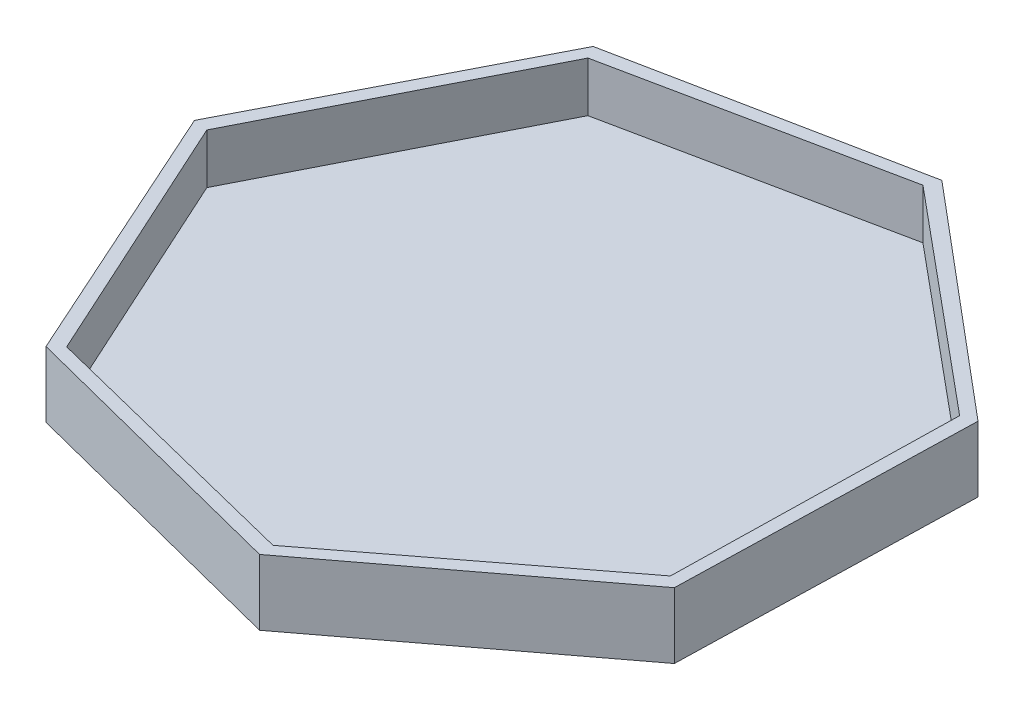
ISO-10303-21;
HEADER;
FILE_DESCRIPTION(('STEP AP214'),'2;1');
FILE_NAME('part.step','',(''),(''),'','','');
FILE_SCHEMA(('AUTOMOTIVE_DESIGN { 1 0 10303 214 1 1 1 1 }'));
ENDSEC;
DATA;
#1=APPLICATION_CONTEXT('core data for automotive mechanical design processes');
#2=APPLICATION_PROTOCOL_DEFINITION('international standard','automotive_design',2000,#1);
#3=PRODUCT_CONTEXT('',#1,'mechanical');
#4=PRODUCT('Part','Part','',(#3));
#5=PRODUCT_RELATED_PRODUCT_CATEGORY('part','',(#4));
#6=PRODUCT_DEFINITION_FORMATION('','',#4);
#7=PRODUCT_DEFINITION_CONTEXT('part definition',#1,'design');
#8=PRODUCT_DEFINITION('design','',#6,#7);
#9=PRODUCT_DEFINITION_SHAPE('','',#8);
#10=(LENGTH_UNIT() NAMED_UNIT(*) SI_UNIT(.MILLI.,.METRE.));
#11=(NAMED_UNIT(*) PLANE_ANGLE_UNIT() SI_UNIT($,.RADIAN.));
#12=(NAMED_UNIT(*) SI_UNIT($,.STERADIAN.) SOLID_ANGLE_UNIT());
#13=UNCERTAINTY_MEASURE_WITH_UNIT(LENGTH_MEASURE(1.E-05),#10,'distance_accuracy_value','');
#14=(GEOMETRIC_REPRESENTATION_CONTEXT(3) GLOBAL_UNCERTAINTY_ASSIGNED_CONTEXT((#13)) GLOBAL_UNIT_ASSIGNED_CONTEXT((#10,
#11,#12)) REPRESENTATION_CONTEXT('',''));
#15=CARTESIAN_POINT('',(0.,0.,0.));
#16=DIRECTION('',(0.,0.,1.));
#17=DIRECTION('',(1.,0.,0.));
#18=AXIS2_PLACEMENT_3D('',#15,#16,#17);
#19=CARTESIAN_POINT('',(-25.9635966528561,5.,-0.669763423308489));
#20=DIRECTION('',(0.911858095260724,0.,-0.410505559167576));
#21=DIRECTION('',(-0.410505559167576,0.,-0.911858095260724));
#22=AXIS2_PLACEMENT_3D('',#19,#20,#21);
#23=PLANE('',#22);
#24=DIRECTION('',(0.410505559167576,0.,0.911858095260724));
#25=VECTOR('',#24,1.);
#26=CARTESIAN_POINT('',(-25.9635966528561,0.,-0.669763423308489));
#27=LINE('',#26,#25);
#28=CARTESIAN_POINT('',(-25.9635966528561,0.,-0.669763423308489));
#29=VERTEX_POINT('',#28);
#30=CARTESIAN_POINT('',(-16.7116798627775,0.,19.8815665972136));
#31=VERTEX_POINT('',#30);
#32=EDGE_CURVE('E135',#29,#31,#27,.T.);
#33=ORIENTED_EDGE('',*,*,#32,.T.);
#34=DIRECTION('',(0.,-1.,0.));
#35=VECTOR('',#34,1.);
#36=CARTESIAN_POINT('',(-16.7116798627775,5.,19.8815665972136));
#37=LINE('',#36,#35);
#38=CARTESIAN_POINT('',(-16.7116798627775,5.,19.8815665972136));
#39=VERTEX_POINT('',#38);
#40=EDGE_CURVE('E11',#39,#31,#37,.T.);
#41=ORIENTED_EDGE('',*,*,#40,.F.);
#42=DIRECTION('',(0.410505559167576,0.,0.911858095260724));
#43=VECTOR('',#42,1.);
#44=CARTESIAN_POINT('',(-25.9635966528561,5.,-0.669763423308489));
#45=LINE('',#44,#43);
#46=CARTESIAN_POINT('',(-25.9635966528561,5.,-0.669763423308489));
#47=VERTEX_POINT('',#46);
#48=EDGE_CURVE('E149',#47,#39,#45,.T.);
#49=ORIENTED_EDGE('',*,*,#48,.F.);
#50=DIRECTION('',(0.,-1.,0.));
#51=VECTOR('',#50,1.);
#52=CARTESIAN_POINT('',(-25.9635966528561,5.,-0.669763423308489));
#53=LINE('',#52,#51);
#54=EDGE_CURVE('E131',#47,#29,#53,.T.);
#55=ORIENTED_EDGE('',*,*,#54,.T.);
#56=EDGE_LOOP('',(#33,#41,#49,#55));
#57=FACE_BOUND('',#56,.T.);
#58=ADVANCED_FACE('F33',(#57),#23,.F.);
#59=CARTESIAN_POINT('',(-16.7116798627775,5.,19.8815665972136));
#60=DIRECTION('',(0.247588053252038,0.,-0.968865396165466));
#61=DIRECTION('',(-0.968865396165466,0.,-0.247588053252038));
#62=AXIS2_PLACEMENT_3D('',#59,#60,#61);
#63=PLANE('',#62);
#64=DIRECTION('',(0.968865396165466,0.,0.247588053252038));
#65=VECTOR('',#64,1.);
#66=CARTESIAN_POINT('',(-16.7116798627775,0.,19.8815665972136));
#67=LINE('',#66,#65);
#68=CARTESIAN_POINT('',(5.12447272011667,0.,25.4616714599844));
#69=VERTEX_POINT('',#68);
#70=EDGE_CURVE('E138',#31,#69,#67,.T.);
#71=ORIENTED_EDGE('',*,*,#70,.T.);
#72=DIRECTION('',(0.,-1.,0.));
#73=VECTOR('',#72,1.);
#74=CARTESIAN_POINT('',(5.12447272011667,5.,25.4616714599844));
#75=LINE('',#74,#73);
#76=CARTESIAN_POINT('',(5.12447272011667,5.,25.4616714599844));
#77=VERTEX_POINT('',#76);
#78=EDGE_CURVE('E40',#77,#69,#75,.T.);
#79=ORIENTED_EDGE('',*,*,#78,.F.);
#80=DIRECTION('',(0.968865396165466,0.,0.247588053252038));
#81=VECTOR('',#80,1.);
#82=CARTESIAN_POINT('',(-16.7116798627775,5.,19.8815665972136));
#83=LINE('',#82,#81);
#84=EDGE_CURVE('E94',#39,#77,#83,.T.);
#85=ORIENTED_EDGE('',*,*,#84,.F.);
#86=ORIENTED_EDGE('',*,*,#40,.T.);
#87=EDGE_LOOP('',(#71,#79,#85,#86));
#88=FACE_BOUND('',#87,.T.);
#89=ADVANCED_FACE('F295',(#88),#63,.F.);
#90=CARTESIAN_POINT('',(5.12447272011667,5.,25.4616714599844));
#91=DIRECTION('',(-0.603120842731318,0.,-0.797649828598405));
#92=DIRECTION('',(-0.797649828598405,0.,0.603120842731318));
#93=AXIS2_PLACEMENT_3D('',#90,#91,#92);
#94=PLANE('',#93);
#95=DIRECTION('',(0.797649828598405,0.,-0.603120842731318));
#96=VECTOR('',#95,1.);
#97=CARTESIAN_POINT('',(5.12447272011667,0.,25.4616714599844));
#98=LINE('',#97,#96);
#99=CARTESIAN_POINT('',(23.1017928245695,0.,11.868618389942));
#100=VERTEX_POINT('',#99);
#101=EDGE_CURVE('E141',#69,#100,#98,.T.);
#102=ORIENTED_EDGE('',*,*,#101,.T.);
#103=DIRECTION('',(0.,-1.,0.));
#104=VECTOR('',#103,1.);
#105=CARTESIAN_POINT('',(23.1017928245695,5.,11.868618389942));
#106=LINE('',#105,#104);
#107=CARTESIAN_POINT('',(23.1017928245695,5.,11.868618389942));
#108=VERTEX_POINT('',#107);
#109=EDGE_CURVE('E153',#108,#100,#106,.T.);
#110=ORIENTED_EDGE('',*,*,#109,.F.);
#111=DIRECTION('',(0.797649828598405,0.,-0.603120842731318));
#112=VECTOR('',#111,1.);
#113=CARTESIAN_POINT('',(5.12447272011667,5.,25.4616714599844));
#114=LINE('',#113,#112);
#115=EDGE_CURVE('E161',#77,#108,#114,.T.);
#116=ORIENTED_EDGE('',*,*,#115,.F.);
#117=ORIENTED_EDGE('',*,*,#78,.T.);
#118=EDGE_LOOP('',(#102,#110,#116,#117));
#119=FACE_BOUND('',#118,.T.);
#120=ADVANCED_FACE('F159',(#119),#94,.F.);
#121=CARTESIAN_POINT('',(23.1017928245695,5.,11.868618389942));
#122=DIRECTION('',(-0.999667442714883,0.,-0.0257876710054741));
#123=DIRECTION('',(-0.0257876710054741,0.,0.999667442714883));
#124=AXIS2_PLACEMENT_3D('',#121,#122,#123);
#125=PLANE('',#124);
#126=DIRECTION('',(0.0257876710054741,0.,-0.999667442714883));
#127=VECTOR('',#126,1.);
#128=CARTESIAN_POINT('',(23.1017928245695,0.,11.868618389942));
#129=LINE('',#128,#127);
#130=CARTESIAN_POINT('',(23.682991741428,0.,-10.6617464034206));
#131=VERTEX_POINT('',#130);
#132=EDGE_CURVE('E143',#100,#131,#129,.T.);
#133=ORIENTED_EDGE('',*,*,#132,.T.);
#134=DIRECTION('',(0.,-1.,0.));
#135=VECTOR('',#134,1.);
#136=CARTESIAN_POINT('',(23.682991741428,5.,-10.6617464034206));
#137=LINE('',#136,#135);
#138=CARTESIAN_POINT('',(23.682991741428,5.,-10.6617464034206));
#139=VERTEX_POINT('',#138);
#140=EDGE_CURVE('E126',#139,#131,#137,.T.);
#141=ORIENTED_EDGE('',*,*,#140,.F.);
#142=DIRECTION('',(0.0257876710054741,0.,-0.999667442714883));
#143=VECTOR('',#142,1.);
#144=CARTESIAN_POINT('',(23.1017928245695,5.,11.868618389942));
#145=LINE('',#144,#143);
#146=EDGE_CURVE('E114',#108,#139,#145,.T.);
#147=ORIENTED_EDGE('',*,*,#146,.F.);
#148=ORIENTED_EDGE('',*,*,#109,.T.);
#149=EDGE_LOOP('',(#133,#141,#147,#148));
#150=FACE_BOUND('',#149,.T.);
#151=ADVANCED_FACE('F167',(#150),#125,.F.);
#152=CARTESIAN_POINT('',(23.682991741428,5.,-10.6617464034206));
#153=DIRECTION('',(-0.643444068834542,0.,0.765493128827196));
#154=DIRECTION('',(0.765493128827196,0.,0.643444068834542));
#155=AXIS2_PLACEMENT_3D('',#152,#153,#154);
#156=PLANE('',#155);
#157=DIRECTION('',(-0.765493128827196,0.,-0.643444068834542));
#158=VECTOR('',#157,1.);
#159=CARTESIAN_POINT('',(23.682991741428,0.,-10.6617464034206));
#160=LINE('',#159,#158);
#161=CARTESIAN_POINT('',(6.43041483200048,0.,-25.1635986950156));
#162=VERTEX_POINT('',#161);
#163=EDGE_CURVE('E123',#131,#162,#160,.T.);
#164=ORIENTED_EDGE('',*,*,#163,.T.);
#165=DIRECTION('',(0.,-1.,0.));
#166=VECTOR('',#165,1.);
#167=CARTESIAN_POINT('',(6.43041483200048,5.,-25.1635986950156));
#168=LINE('',#167,#166);
#169=CARTESIAN_POINT('',(6.43041483200048,5.,-25.1635986950156));
#170=VERTEX_POINT('',#169);
#171=EDGE_CURVE('E120',#170,#162,#168,.T.);
#172=ORIENTED_EDGE('',*,*,#171,.F.);
#173=DIRECTION('',(-0.765493128827196,0.,-0.643444068834542));
#174=VECTOR('',#173,1.);
#175=CARTESIAN_POINT('',(23.682991741428,5.,-10.6617464034206));
#176=LINE('',#175,#174);
#177=EDGE_CURVE('E107',#139,#170,#176,.T.);
#178=ORIENTED_EDGE('',*,*,#177,.F.);
#179=ORIENTED_EDGE('',*,*,#140,.T.);
#180=EDGE_LOOP('',(#164,#172,#178,#179));
#181=FACE_BOUND('',#180,.T.);
#182=ADVANCED_FACE('F121',(#181),#156,.F.);
#183=CARTESIAN_POINT('',(6.43041483200048,5.,-25.1635986950156));
#184=DIRECTION('',(0.197305812745234,0.,0.98034198943886));
#185=DIRECTION('',(0.98034198943886,0.,-0.197305812745234));
#186=AXIS2_PLACEMENT_3D('',#183,#184,#185);
#187=PLANE('',#186);
#188=DIRECTION('',(-0.98034198943886,0.,0.197305812745234));
#189=VECTOR('',#188,1.);
#190=CARTESIAN_POINT('',(6.43041483200048,0.,-25.1635986950156));
#191=LINE('',#190,#189);
#192=CARTESIAN_POINT('',(-15.6643956024812,0.,-20.7167479253953));
#193=VERTEX_POINT('',#192);
#194=EDGE_CURVE('E146',#162,#193,#191,.T.);
#195=ORIENTED_EDGE('',*,*,#194,.T.);
#196=DIRECTION('',(0.,-1.,0.));
#197=VECTOR('',#196,1.);
#198=CARTESIAN_POINT('',(-15.6643956024812,5.,-20.7167479253953));
#199=LINE('',#198,#197);
#200=CARTESIAN_POINT('',(-15.6643956024812,5.,-20.7167479253953));
#201=VERTEX_POINT('',#200);
#202=EDGE_CURVE('E127',#201,#193,#199,.T.);
#203=ORIENTED_EDGE('',*,*,#202,.F.);
#204=DIRECTION('',(-0.98034198943886,0.,0.197305812745234));
#205=VECTOR('',#204,1.);
#206=CARTESIAN_POINT('',(6.43041483200048,5.,-25.1635986950156));
#207=LINE('',#206,#205);
#208=EDGE_CURVE('E111',#170,#201,#207,.T.);
#209=ORIENTED_EDGE('',*,*,#208,.F.);
#210=ORIENTED_EDGE('',*,*,#171,.T.);
#211=EDGE_LOOP('',(#195,#203,#209,#210));
#212=FACE_BOUND('',#211,.T.);
#213=ADVANCED_FACE('F129',(#212),#187,.F.);
#214=CARTESIAN_POINT('',(-15.6643956024812,5.,-20.7167479253953));
#215=DIRECTION('',(0.889480393022744,0.,0.456973336670866));
#216=DIRECTION('',(0.456973336670866,0.,-0.889480393022744));
#217=AXIS2_PLACEMENT_3D('',#214,#215,#216);
#218=PLANE('',#217);
#219=DIRECTION('',(-0.456973336670866,0.,0.889480393022744));
#220=VECTOR('',#219,1.);
#221=CARTESIAN_POINT('',(-15.6643956024812,0.,-20.7167479253953));
#222=LINE('',#221,#220);
#223=EDGE_CURVE('E86',#193,#29,#222,.T.);
#224=ORIENTED_EDGE('',*,*,#223,.T.);
#225=ORIENTED_EDGE('',*,*,#54,.F.);
#226=DIRECTION('',(-0.456973336670866,0.,0.889480393022744));
#227=VECTOR('',#226,1.);
#228=CARTESIAN_POINT('',(-15.6643956024812,5.,-20.7167479253953));
#229=LINE('',#228,#227);
#230=EDGE_CURVE('E56',#201,#47,#229,.T.);
#231=ORIENTED_EDGE('',*,*,#230,.F.);
#232=ORIENTED_EDGE('',*,*,#202,.T.);
#233=EDGE_LOOP('',(#224,#225,#231,#232));
#234=FACE_BOUND('',#233,.T.);
#235=ADVANCED_FACE('F302',(#234),#218,.F.);
#236=CARTESIAN_POINT('',(0.,5.,0.));
#237=DIRECTION('',(0.,1.,0.));
#238=DIRECTION('',(0.,0.,1.));
#239=AXIS2_PLACEMENT_3D('',#236,#237,#238);
#240=PLANE('',#239);
#241=DIRECTION('',(-0.768866637447622,0.,-0.6394091755832));
#242=VECTOR('',#241,1.);
#243=CARTESIAN_POINT('',(22.6201437552723,5.,-10.3266868379717));
#244=LINE('',#243,#242);
#245=CARTESIAN_POINT('',(22.6201437552723,5.,-10.3266868379717));
#246=VERTEX_POINT('',#245);
#247=CARTESIAN_POINT('',(6.02970006847634,5.,-24.1237244562886));
#248=VERTEX_POINT('',#247);
#249=EDGE_CURVE('E47',#246,#248,#244,.T.);
#250=ORIENTED_EDGE('',*,*,#249,.F.);
#251=DIRECTION('',(0.0205297162118656,0.,-0.999789243166909));
#252=VECTOR('',#251,1.);
#253=CARTESIAN_POINT('',(22.1771578275053,5.,11.2465565953604));
#254=LINE('',#253,#252);
#255=CARTESIAN_POINT('',(22.1771578275053,5.,11.2465565953604));
#256=VERTEX_POINT('',#255);
#257=EDGE_CURVE('E191',#256,#246,#254,.T.);
#258=ORIENTED_EDGE('',*,*,#257,.F.);
#259=DIRECTION('',(0.794466774833926,0.,-0.607307618662058));
#260=VECTOR('',#259,1.);
#261=CARTESIAN_POINT('',(5.03431972404994,5.,24.3509135244402));
#262=LINE('',#261,#260);
#263=CARTESIAN_POINT('',(5.03431972404994,5.,24.3509135244402));
#264=VERTEX_POINT('',#263);
#265=EDGE_CURVE('E195',#264,#256,#262,.T.);
#266=ORIENTED_EDGE('',*,*,#265,.F.);
#267=DIRECTION('',(0.970154147837238,0.,0.242489029513096));
#268=VECTOR('',#267,1.);
#269=CARTESIAN_POINT('',(-15.8994638130225,5.,19.1185359015044));
#270=LINE('',#269,#268);
#271=CARTESIAN_POINT('',(-15.8994638130225,5.,19.1185359015044));
#272=VERTEX_POINT('',#271);
#273=EDGE_CURVE('E198',#272,#264,#270,.T.);
#274=ORIENTED_EDGE('',*,*,#273,.F.);
#275=DIRECTION('',(0.415295659981009,0.,0.909686492590133));
#276=VECTOR('',#275,1.);
#277=CARTESIAN_POINT('',(-24.8606268089329,5.,-0.510489202324105));
#278=LINE('',#277,#276);
#279=CARTESIAN_POINT('',(-24.8606268089329,5.,-0.510489202324105));
#280=VERTEX_POINT('',#279);
#281=EDGE_CURVE('E201',#280,#272,#278,.T.);
#282=ORIENTED_EDGE('',*,*,#281,.F.);
#283=DIRECTION('',(-0.452288930328535,0.,0.89187147252408));
#284=VECTOR('',#283,1.);
#285=CARTESIAN_POINT('',(-15.1012307533485,5.,-19.7551055247205));
#286=LINE('',#285,#284);
#287=CARTESIAN_POINT('',(-15.1012307533485,5.,-19.7551055247205));
#288=VERTEX_POINT('',#287);
#289=EDGE_CURVE('E204',#288,#280,#286,.T.);
#290=ORIENTED_EDGE('',*,*,#289,.F.);
#291=DIRECTION('',(-0.979290731087882,0.,0.202459042784858));
#292=VECTOR('',#291,1.);
#293=CARTESIAN_POINT('',(6.02970006847634,5.,-24.1237244562886));
#294=LINE('',#293,#292);
#295=EDGE_CURVE('E207',#248,#288,#294,.T.);
#296=ORIENTED_EDGE('',*,*,#295,.F.);
#297=EDGE_LOOP('',(#250,#258,#266,#274,#282,#290,#296));
#298=FACE_BOUND('',#297,.T.);
#299=ORIENTED_EDGE('',*,*,#48,.T.);
#300=ORIENTED_EDGE('',*,*,#84,.T.);
#301=ORIENTED_EDGE('',*,*,#115,.T.);
#302=ORIENTED_EDGE('',*,*,#146,.T.);
#303=ORIENTED_EDGE('',*,*,#177,.T.);
#304=ORIENTED_EDGE('',*,*,#208,.T.);
#305=ORIENTED_EDGE('',*,*,#230,.T.);
#306=EDGE_LOOP('',(#299,#300,#301,#302,#303,#304,#305));
#307=FACE_BOUND('',#306,.T.);
#308=ADVANCED_FACE('F109',(#298,#307),#240,.T.);
#309=CARTESIAN_POINT('',(0.,0.,0.));
#310=DIRECTION('',(0.,1.,0.));
#311=DIRECTION('',(0.,0.,1.));
#312=AXIS2_PLACEMENT_3D('',#309,#310,#311);
#313=PLANE('',#312);
#314=ORIENTED_EDGE('',*,*,#32,.F.);
#315=ORIENTED_EDGE('',*,*,#223,.F.);
#316=ORIENTED_EDGE('',*,*,#194,.F.);
#317=ORIENTED_EDGE('',*,*,#163,.F.);
#318=ORIENTED_EDGE('',*,*,#132,.F.);
#319=ORIENTED_EDGE('',*,*,#101,.F.);
#320=ORIENTED_EDGE('',*,*,#70,.F.);
#321=EDGE_LOOP('',(#314,#315,#316,#317,#318,#319,#320));
#322=FACE_BOUND('',#321,.T.);
#323=ADVANCED_FACE('F165',(#322),#313,.F.);
#324=CARTESIAN_POINT('',(22.6201437552723,1.2,-10.3266868379717));
#325=DIRECTION('',(0.6394091755832,0.,-0.768866637447622));
#326=DIRECTION('',(-0.768866637447622,0.,-0.6394091755832));
#327=AXIS2_PLACEMENT_3D('',#324,#325,#326);
#328=PLANE('',#327);
#329=ORIENTED_EDGE('',*,*,#249,.T.);
#330=DIRECTION('',(0.,1.,0.));
#331=VECTOR('',#330,1.);
#332=CARTESIAN_POINT('',(6.02970006847634,1.2,-24.1237244562886));
#333=LINE('',#332,#331);
#334=CARTESIAN_POINT('',(6.02970006847634,1.2,-24.1237244562886));
#335=VERTEX_POINT('',#334);
#336=EDGE_CURVE('E172',#335,#248,#333,.T.);
#337=ORIENTED_EDGE('',*,*,#336,.F.);
#338=DIRECTION('',(-0.768866637447622,0.,-0.6394091755832));
#339=VECTOR('',#338,1.);
#340=CARTESIAN_POINT('',(22.6201437552723,1.2,-10.3266868379717));
#341=LINE('',#340,#339);
#342=CARTESIAN_POINT('',(22.6201437552723,1.2,-10.3266868379717));
#343=VERTEX_POINT('',#342);
#344=EDGE_CURVE('E194',#343,#335,#341,.T.);
#345=ORIENTED_EDGE('',*,*,#344,.F.);
#346=DIRECTION('',(0.,1.,0.));
#347=VECTOR('',#346,1.);
#348=CARTESIAN_POINT('',(22.6201437552723,1.2,-10.3266868379717));
#349=LINE('',#348,#347);
#350=EDGE_CURVE('E139',#343,#246,#349,.T.);
#351=ORIENTED_EDGE('',*,*,#350,.T.);
#352=EDGE_LOOP('',(#329,#337,#345,#351));
#353=FACE_BOUND('',#352,.T.);
#354=ADVANCED_FACE('F237',(#353),#328,.F.);
#355=CARTESIAN_POINT('',(22.1771578275053,1.2,11.2465565953604));
#356=DIRECTION('',(0.999789243166909,0.,0.0205297162118656));
#357=DIRECTION('',(0.0205297162118656,0.,-0.999789243166909));
#358=AXIS2_PLACEMENT_3D('',#355,#356,#357);
#359=PLANE('',#358);
#360=ORIENTED_EDGE('',*,*,#257,.T.);
#361=ORIENTED_EDGE('',*,*,#350,.F.);
#362=DIRECTION('',(0.0205297162118656,0.,-0.999789243166909));
#363=VECTOR('',#362,1.);
#364=CARTESIAN_POINT('',(22.1771578275053,1.2,11.2465565953604));
#365=LINE('',#364,#363);
#366=CARTESIAN_POINT('',(22.1771578275053,1.2,11.2465565953604));
#367=VERTEX_POINT('',#366);
#368=EDGE_CURVE('E175',#367,#343,#365,.T.);
#369=ORIENTED_EDGE('',*,*,#368,.F.);
#370=DIRECTION('',(0.,1.,0.));
#371=VECTOR('',#370,1.);
#372=CARTESIAN_POINT('',(22.1771578275053,1.2,11.2465565953604));
#373=LINE('',#372,#371);
#374=EDGE_CURVE('E187',#367,#256,#373,.T.);
#375=ORIENTED_EDGE('',*,*,#374,.T.);
#376=EDGE_LOOP('',(#360,#361,#369,#375));
#377=FACE_BOUND('',#376,.T.);
#378=ADVANCED_FACE('F255',(#377),#359,.F.);
#379=CARTESIAN_POINT('',(5.03431972404994,1.2,24.3509135244402));
#380=DIRECTION('',(0.607307618662058,0.,0.794466774833926));
#381=DIRECTION('',(0.794466774833926,0.,-0.607307618662058));
#382=AXIS2_PLACEMENT_3D('',#379,#380,#381);
#383=PLANE('',#382);
#384=ORIENTED_EDGE('',*,*,#265,.T.);
#385=ORIENTED_EDGE('',*,*,#374,.F.);
#386=DIRECTION('',(0.794466774833926,0.,-0.607307618662058));
#387=VECTOR('',#386,1.);
#388=CARTESIAN_POINT('',(5.03431972404994,1.2,24.3509135244402));
#389=LINE('',#388,#387);
#390=CARTESIAN_POINT('',(5.03431972404994,1.2,24.3509135244402));
#391=VERTEX_POINT('',#390);
#392=EDGE_CURVE('E213',#391,#367,#389,.T.);
#393=ORIENTED_EDGE('',*,*,#392,.F.);
#394=DIRECTION('',(0.,1.,0.));
#395=VECTOR('',#394,1.);
#396=CARTESIAN_POINT('',(5.03431972404994,1.2,24.3509135244402));
#397=LINE('',#396,#395);
#398=EDGE_CURVE('E184',#391,#264,#397,.T.);
#399=ORIENTED_EDGE('',*,*,#398,.T.);
#400=EDGE_LOOP('',(#384,#385,#393,#399));
#401=FACE_BOUND('',#400,.T.);
#402=ADVANCED_FACE('F260',(#401),#383,.F.);
#403=CARTESIAN_POINT('',(-15.8994638130225,1.2,19.1185359015044));
#404=DIRECTION('',(-0.242489029513096,0.,0.970154147837238));
#405=DIRECTION('',(0.970154147837238,0.,0.242489029513096));
#406=AXIS2_PLACEMENT_3D('',#403,#404,#405);
#407=PLANE('',#406);
#408=ORIENTED_EDGE('',*,*,#273,.T.);
#409=ORIENTED_EDGE('',*,*,#398,.F.);
#410=DIRECTION('',(0.970154147837238,0.,0.242489029513096));
#411=VECTOR('',#410,1.);
#412=CARTESIAN_POINT('',(-15.8994638130225,1.2,19.1185359015044));
#413=LINE('',#412,#411);
#414=CARTESIAN_POINT('',(-15.8994638130225,1.2,19.1185359015044));
#415=VERTEX_POINT('',#414);
#416=EDGE_CURVE('E216',#415,#391,#413,.T.);
#417=ORIENTED_EDGE('',*,*,#416,.F.);
#418=DIRECTION('',(0.,1.,0.));
#419=VECTOR('',#418,1.);
#420=CARTESIAN_POINT('',(-15.8994638130225,1.2,19.1185359015044));
#421=LINE('',#420,#419);
#422=EDGE_CURVE('E181',#415,#272,#421,.T.);
#423=ORIENTED_EDGE('',*,*,#422,.T.);
#424=EDGE_LOOP('',(#408,#409,#417,#423));
#425=FACE_BOUND('',#424,.T.);
#426=ADVANCED_FACE('F283',(#425),#407,.F.);
#427=CARTESIAN_POINT('',(-24.8606268089329,1.2,-0.510489202324105));
#428=DIRECTION('',(-0.909686492590133,0.,0.415295659981009));
#429=DIRECTION('',(0.415295659981009,0.,0.909686492590133));
#430=AXIS2_PLACEMENT_3D('',#427,#428,#429);
#431=PLANE('',#430);
#432=ORIENTED_EDGE('',*,*,#281,.T.);
#433=ORIENTED_EDGE('',*,*,#422,.F.);
#434=DIRECTION('',(0.415295659981009,0.,0.909686492590133));
#435=VECTOR('',#434,1.);
#436=CARTESIAN_POINT('',(-24.8606268089329,1.2,-0.510489202324105));
#437=LINE('',#436,#435);
#438=CARTESIAN_POINT('',(-24.8606268089329,1.2,-0.510489202324105));
#439=VERTEX_POINT('',#438);
#440=EDGE_CURVE('E219',#439,#415,#437,.T.);
#441=ORIENTED_EDGE('',*,*,#440,.F.);
#442=DIRECTION('',(0.,1.,0.));
#443=VECTOR('',#442,1.);
#444=CARTESIAN_POINT('',(-24.8606268089329,1.2,-0.510489202324105));
#445=LINE('',#444,#443);
#446=EDGE_CURVE('E178',#439,#280,#445,.T.);
#447=ORIENTED_EDGE('',*,*,#446,.T.);
#448=EDGE_LOOP('',(#432,#433,#441,#447));
#449=FACE_BOUND('',#448,.T.);
#450=ADVANCED_FACE('F285',(#449),#431,.F.);
#451=CARTESIAN_POINT('',(-15.1012307533485,1.2,-19.7551055247205));
#452=DIRECTION('',(-0.89187147252408,0.,-0.452288930328534));
#453=DIRECTION('',(-0.452288930328535,0.,0.89187147252408));
#454=AXIS2_PLACEMENT_3D('',#451,#452,#453);
#455=PLANE('',#454);
#456=ORIENTED_EDGE('',*,*,#289,.T.);
#457=ORIENTED_EDGE('',*,*,#446,.F.);
#458=DIRECTION('',(-0.452288930328535,0.,0.89187147252408));
#459=VECTOR('',#458,1.);
#460=CARTESIAN_POINT('',(-15.1012307533485,1.2,-19.7551055247205));
#461=LINE('',#460,#459);
#462=CARTESIAN_POINT('',(-15.1012307533485,1.2,-19.7551055247205));
#463=VERTEX_POINT('',#462);
#464=EDGE_CURVE('E222',#463,#439,#461,.T.);
#465=ORIENTED_EDGE('',*,*,#464,.F.);
#466=DIRECTION('',(0.,1.,0.));
#467=VECTOR('',#466,1.);
#468=CARTESIAN_POINT('',(-15.1012307533485,1.2,-19.7551055247205));
#469=LINE('',#468,#467);
#470=EDGE_CURVE('E174',#463,#288,#469,.T.);
#471=ORIENTED_EDGE('',*,*,#470,.T.);
#472=EDGE_LOOP('',(#456,#457,#465,#471));
#473=FACE_BOUND('',#472,.T.);
#474=ADVANCED_FACE('F275',(#473),#455,.F.);
#475=CARTESIAN_POINT('',(6.02970006847634,1.2,-24.1237244562886));
#476=DIRECTION('',(-0.202459042784858,0.,-0.979290731087882));
#477=DIRECTION('',(-0.979290731087882,0.,0.202459042784858));
#478=AXIS2_PLACEMENT_3D('',#475,#476,#477);
#479=PLANE('',#478);
#480=ORIENTED_EDGE('',*,*,#295,.T.);
#481=ORIENTED_EDGE('',*,*,#470,.F.);
#482=DIRECTION('',(-0.979290731087882,0.,0.202459042784858));
#483=VECTOR('',#482,1.);
#484=CARTESIAN_POINT('',(6.02970006847634,1.2,-24.1237244562886));
#485=LINE('',#484,#483);
#486=EDGE_CURVE('E225',#335,#463,#485,.T.);
#487=ORIENTED_EDGE('',*,*,#486,.F.);
#488=ORIENTED_EDGE('',*,*,#336,.T.);
#489=EDGE_LOOP('',(#480,#481,#487,#488));
#490=FACE_BOUND('',#489,.T.);
#491=ADVANCED_FACE('F269',(#490),#479,.F.);
#492=CARTESIAN_POINT('',(0.,1.2,0.));
#493=DIRECTION('',(0.,1.,0.));
#494=DIRECTION('',(0.,0.,1.));
#495=AXIS2_PLACEMENT_3D('',#492,#493,#494);
#496=PLANE('',#495);
#497=ORIENTED_EDGE('',*,*,#344,.T.);
#498=ORIENTED_EDGE('',*,*,#486,.T.);
#499=ORIENTED_EDGE('',*,*,#464,.T.);
#500=ORIENTED_EDGE('',*,*,#440,.T.);
#501=ORIENTED_EDGE('',*,*,#416,.T.);
#502=ORIENTED_EDGE('',*,*,#392,.T.);
#503=ORIENTED_EDGE('',*,*,#368,.T.);
#504=EDGE_LOOP('',(#497,#498,#499,#500,#501,#502,#503));
#505=FACE_BOUND('',#504,.T.);
#506=ADVANCED_FACE('F232',(#505),#496,.T.);
#507=CLOSED_SHELL('',(#58,#89,#120,#151,#182,#213,#235,#308,#323,#354,#378,#402,#426,#450,#474,
#491,#506));
#508=MANIFOLD_SOLID_BREP('B2',#507);
#509=ADVANCED_BREP_SHAPE_REPRESENTATION('',(#18,#508),#14);
#510=SHAPE_DEFINITION_REPRESENTATION(#9,#509);
ENDSEC;
END-ISO-10303-21;
